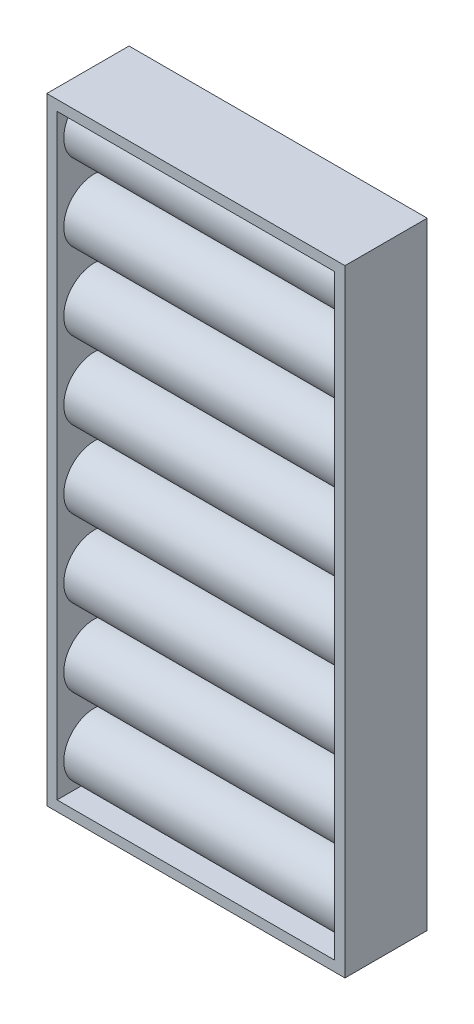
ISO-10303-21;
HEADER;
FILE_DESCRIPTION(('STEP AP214'),'2;1');
FILE_NAME('part.step','',(''),(''),'','','');
FILE_SCHEMA(('AUTOMOTIVE_DESIGN { 1 0 10303 214 1 1 1 1 }'));
ENDSEC;
DATA;
#1=APPLICATION_CONTEXT('core data for automotive mechanical design processes');
#2=APPLICATION_PROTOCOL_DEFINITION('international standard','automotive_design',2000,#1);
#3=PRODUCT_CONTEXT('',#1,'mechanical');
#4=PRODUCT('Part','Part','',(#3));
#5=PRODUCT_RELATED_PRODUCT_CATEGORY('part','',(#4));
#6=PRODUCT_DEFINITION_FORMATION('','',#4);
#7=PRODUCT_DEFINITION_CONTEXT('part definition',#1,'design');
#8=PRODUCT_DEFINITION('design','',#6,#7);
#9=PRODUCT_DEFINITION_SHAPE('','',#8);
#10=(LENGTH_UNIT() NAMED_UNIT(*) SI_UNIT(.MILLI.,.METRE.));
#11=(NAMED_UNIT(*) PLANE_ANGLE_UNIT() SI_UNIT($,.RADIAN.));
#12=(NAMED_UNIT(*) SI_UNIT($,.STERADIAN.) SOLID_ANGLE_UNIT());
#13=UNCERTAINTY_MEASURE_WITH_UNIT(LENGTH_MEASURE(1.E-05),#10,'distance_accuracy_value','');
#14=(GEOMETRIC_REPRESENTATION_CONTEXT(3) GLOBAL_UNCERTAINTY_ASSIGNED_CONTEXT((#13)) GLOBAL_UNIT_ASSIGNED_CONTEXT((#10,
#11,#12)) REPRESENTATION_CONTEXT('',''));
#15=CARTESIAN_POINT('',(0.,0.,0.));
#16=DIRECTION('',(0.,0.,1.));
#17=DIRECTION('',(1.,0.,0.));
#18=AXIS2_PLACEMENT_3D('',#15,#16,#17);
#19=CARTESIAN_POINT('',(-27.,52.8497033839413,8.69302719755597));
#20=DIRECTION('',(1.,0.,0.));
#21=DIRECTION('',(0.,1.,0.));
#22=AXIS2_PLACEMENT_3D('',#19,#20,#21);
#23=PLANE('',#22);
#24=CARTESIAN_POINT('',(-27.,52.8497033839413,8.69302719755597));
#25=DIRECTION('',(1.,0.,0.));
#26=DIRECTION('',(0.,1.,0.));
#27=AXIS2_PLACEMENT_3D('',#24,#25,#26);
#28=CIRCLE('',#27,6.);
#29=CARTESIAN_POINT('',(-27.,58.8497033839413,8.69302719755597));
#30=VERTEX_POINT('',#29);
#31=EDGE_CURVE('E51',#30,#30,#28,.T.);
#32=ORIENTED_EDGE('',*,*,#31,.F.);
#33=EDGE_LOOP('',(#32));
#34=FACE_BOUND('',#33,.T.);
#35=ADVANCED_FACE('F44',(#34),#23,.F.);
#36=CARTESIAN_POINT('',(43.9705627484771,52.8497033839413,8.69302719755597));
#37=DIRECTION('',(-1.,0.,0.));
#38=DIRECTION('',(0.,-1.,0.));
#39=AXIS2_PLACEMENT_3D('',#36,#37,#38);
#40=CYLINDRICAL_SURFACE('',#39,6.);
#41=CARTESIAN_POINT('',(27.,52.8497033839413,8.69302719755597));
#42=DIRECTION('',(-1.,0.,0.));
#43=DIRECTION('',(0.,-1.,0.));
#44=AXIS2_PLACEMENT_3D('',#41,#42,#43);
#45=CIRCLE('',#44,6.);
#46=CARTESIAN_POINT('',(27.,46.8497033839413,8.69302719755597));
#47=VERTEX_POINT('',#46);
#48=EDGE_CURVE('E11',#47,#47,#45,.T.);
#49=ORIENTED_EDGE('',*,*,#48,.T.);
#50=EDGE_LOOP('',(#49));
#51=FACE_BOUND('',#50,.T.);
#52=ORIENTED_EDGE('',*,*,#31,.T.);
#53=EDGE_LOOP('',(#52));
#54=FACE_BOUND('',#53,.T.);
#55=ADVANCED_FACE('F46',(#51,#54),#40,.T.);
#56=CARTESIAN_POINT('',(27.,60.,16.));
#57=DIRECTION('',(-1.,0.,0.));
#58=DIRECTION('',(0.,-1.,0.));
#59=AXIS2_PLACEMENT_3D('',#56,#57,#58);
#60=PLANE('',#59);
#61=ORIENTED_EDGE('',*,*,#48,.F.);
#62=EDGE_LOOP('',(#61));
#63=FACE_BOUND('',#62,.T.);
#64=ADVANCED_FACE('F62',(#63),#60,.F.);
#65=CLOSED_SHELL('',(#35,#55,#64));
#66=MANIFOLD_SOLID_BREP('B2',#65);
#67=CARTESIAN_POINT('',(-27.,37.8497033839413,8.69302719755592));
#68=DIRECTION('',(1.,0.,0.));
#69=DIRECTION('',(0.,1.,0.));
#70=AXIS2_PLACEMENT_3D('',#67,#68,#69);
#71=PLANE('',#70);
#72=CARTESIAN_POINT('',(-27.,37.8497033839413,8.69302719755592));
#73=DIRECTION('',(1.,0.,0.));
#74=DIRECTION('',(0.,1.,0.));
#75=AXIS2_PLACEMENT_3D('',#72,#73,#74);
#76=CIRCLE('',#75,6.);
#77=CARTESIAN_POINT('',(-27.,43.8497033839413,8.69302719755592));
#78=VERTEX_POINT('',#77);
#79=EDGE_CURVE('E100',#78,#78,#76,.T.);
#80=ORIENTED_EDGE('',*,*,#79,.F.);
#81=EDGE_LOOP('',(#80));
#82=FACE_BOUND('',#81,.T.);
#83=ADVANCED_FACE('F93',(#82),#71,.F.);
#84=CARTESIAN_POINT('',(43.9705627484771,37.8497033839413,8.69302719755592));
#85=DIRECTION('',(-1.,0.,0.));
#86=DIRECTION('',(0.,-1.,0.));
#87=AXIS2_PLACEMENT_3D('',#84,#85,#86);
#88=CYLINDRICAL_SURFACE('',#87,6.);
#89=CARTESIAN_POINT('',(27.,37.8497033839413,8.69302719755592));
#90=DIRECTION('',(-1.,0.,0.));
#91=DIRECTION('',(0.,-1.,0.));
#92=AXIS2_PLACEMENT_3D('',#89,#90,#91);
#93=CIRCLE('',#92,6.);
#94=CARTESIAN_POINT('',(27.,31.8497033839413,8.69302719755592));
#95=VERTEX_POINT('',#94);
#96=EDGE_CURVE('E43',#95,#95,#93,.T.);
#97=ORIENTED_EDGE('',*,*,#96,.T.);
#98=EDGE_LOOP('',(#97));
#99=FACE_BOUND('',#98,.T.);
#100=ORIENTED_EDGE('',*,*,#79,.T.);
#101=EDGE_LOOP('',(#100));
#102=FACE_BOUND('',#101,.T.);
#103=ADVANCED_FACE('F95',(#99,#102),#88,.T.);
#104=CARTESIAN_POINT('',(27.,60.,16.));
#105=DIRECTION('',(-1.,0.,0.));
#106=DIRECTION('',(0.,-1.,0.));
#107=AXIS2_PLACEMENT_3D('',#104,#105,#106);
#108=PLANE('',#107);
#109=ORIENTED_EDGE('',*,*,#96,.F.);
#110=EDGE_LOOP('',(#109));
#111=FACE_BOUND('',#110,.T.);
#112=ADVANCED_FACE('F111',(#111),#108,.F.);
#113=CLOSED_SHELL('',(#83,#103,#112));
#114=MANIFOLD_SOLID_BREP('B6',#113);
#115=CARTESIAN_POINT('',(-27.,22.8497033839413,8.69302719755586));
#116=DIRECTION('',(1.,0.,0.));
#117=DIRECTION('',(0.,1.,0.));
#118=AXIS2_PLACEMENT_3D('',#115,#116,#117);
#119=PLANE('',#118);
#120=CARTESIAN_POINT('',(-27.,22.8497033839413,8.69302719755586));
#121=DIRECTION('',(1.,0.,0.));
#122=DIRECTION('',(0.,1.,0.));
#123=AXIS2_PLACEMENT_3D('',#120,#121,#122);
#124=CIRCLE('',#123,6.);
#125=CARTESIAN_POINT('',(-27.,28.8497033839413,8.69302719755586));
#126=VERTEX_POINT('',#125);
#127=EDGE_CURVE('E149',#126,#126,#124,.T.);
#128=ORIENTED_EDGE('',*,*,#127,.F.);
#129=EDGE_LOOP('',(#128));
#130=FACE_BOUND('',#129,.T.);
#131=ADVANCED_FACE('F142',(#130),#119,.F.);
#132=CARTESIAN_POINT('',(43.9705627484771,22.8497033839413,8.69302719755586));
#133=DIRECTION('',(-1.,0.,0.));
#134=DIRECTION('',(0.,-1.,0.));
#135=AXIS2_PLACEMENT_3D('',#132,#133,#134);
#136=CYLINDRICAL_SURFACE('',#135,6.);
#137=CARTESIAN_POINT('',(27.,22.8497033839413,8.69302719755586));
#138=DIRECTION('',(-1.,0.,0.));
#139=DIRECTION('',(0.,-1.,0.));
#140=AXIS2_PLACEMENT_3D('',#137,#138,#139);
#141=CIRCLE('',#140,6.);
#142=CARTESIAN_POINT('',(27.,16.8497033839413,8.69302719755586));
#143=VERTEX_POINT('',#142);
#144=EDGE_CURVE('E92',#143,#143,#141,.T.);
#145=ORIENTED_EDGE('',*,*,#144,.T.);
#146=EDGE_LOOP('',(#145));
#147=FACE_BOUND('',#146,.T.);
#148=ORIENTED_EDGE('',*,*,#127,.T.);
#149=EDGE_LOOP('',(#148));
#150=FACE_BOUND('',#149,.T.);
#151=ADVANCED_FACE('F144',(#147,#150),#136,.T.);
#152=CARTESIAN_POINT('',(27.,60.,16.));
#153=DIRECTION('',(-1.,0.,0.));
#154=DIRECTION('',(0.,-1.,0.));
#155=AXIS2_PLACEMENT_3D('',#152,#153,#154);
#156=PLANE('',#155);
#157=ORIENTED_EDGE('',*,*,#144,.F.);
#158=EDGE_LOOP('',(#157));
#159=FACE_BOUND('',#158,.T.);
#160=ADVANCED_FACE('F160',(#159),#156,.F.);
#161=CLOSED_SHELL('',(#131,#151,#160));
#162=MANIFOLD_SOLID_BREP('B38',#161);
#163=CARTESIAN_POINT('',(-27.,7.84970338394127,8.69302719755581));
#164=DIRECTION('',(1.,0.,0.));
#165=DIRECTION('',(0.,1.,0.));
#166=AXIS2_PLACEMENT_3D('',#163,#164,#165);
#167=PLANE('',#166);
#168=CARTESIAN_POINT('',(-27.,7.84970338394127,8.69302719755581));
#169=DIRECTION('',(1.,0.,0.));
#170=DIRECTION('',(0.,1.,0.));
#171=AXIS2_PLACEMENT_3D('',#168,#169,#170);
#172=CIRCLE('',#171,6.);
#173=CARTESIAN_POINT('',(-27.,13.8497033839413,8.69302719755581));
#174=VERTEX_POINT('',#173);
#175=EDGE_CURVE('E198',#174,#174,#172,.T.);
#176=ORIENTED_EDGE('',*,*,#175,.F.);
#177=EDGE_LOOP('',(#176));
#178=FACE_BOUND('',#177,.T.);
#179=ADVANCED_FACE('F191',(#178),#167,.F.);
#180=CARTESIAN_POINT('',(43.9705627484771,7.84970338394128,8.69302719755581));
#181=DIRECTION('',(-1.,0.,0.));
#182=DIRECTION('',(0.,-1.,0.));
#183=AXIS2_PLACEMENT_3D('',#180,#181,#182);
#184=CYLINDRICAL_SURFACE('',#183,6.);
#185=CARTESIAN_POINT('',(27.,7.84970338394128,8.69302719755581));
#186=DIRECTION('',(-1.,0.,0.));
#187=DIRECTION('',(0.,-1.,0.));
#188=AXIS2_PLACEMENT_3D('',#185,#186,#187);
#189=CIRCLE('',#188,6.);
#190=CARTESIAN_POINT('',(27.,1.84970338394128,8.69302719755581));
#191=VERTEX_POINT('',#190);
#192=EDGE_CURVE('E141',#191,#191,#189,.T.);
#193=ORIENTED_EDGE('',*,*,#192,.T.);
#194=EDGE_LOOP('',(#193));
#195=FACE_BOUND('',#194,.T.);
#196=ORIENTED_EDGE('',*,*,#175,.T.);
#197=EDGE_LOOP('',(#196));
#198=FACE_BOUND('',#197,.T.);
#199=ADVANCED_FACE('F193',(#195,#198),#184,.T.);
#200=CARTESIAN_POINT('',(27.,60.,16.));
#201=DIRECTION('',(-1.,0.,0.));
#202=DIRECTION('',(0.,-1.,0.));
#203=AXIS2_PLACEMENT_3D('',#200,#201,#202);
#204=PLANE('',#203);
#205=ORIENTED_EDGE('',*,*,#192,.F.);
#206=EDGE_LOOP('',(#205));
#207=FACE_BOUND('',#206,.T.);
#208=ADVANCED_FACE('F209',(#207),#204,.F.);
#209=CLOSED_SHELL('',(#179,#199,#208));
#210=MANIFOLD_SOLID_BREP('B87',#209);
#211=CARTESIAN_POINT('',(-27.,-7.15029661605873,8.69302719755576));
#212=DIRECTION('',(1.,0.,0.));
#213=DIRECTION('',(0.,1.,0.));
#214=AXIS2_PLACEMENT_3D('',#211,#212,#213);
#215=PLANE('',#214);
#216=CARTESIAN_POINT('',(-27.,-7.15029661605873,8.69302719755576));
#217=DIRECTION('',(1.,0.,0.));
#218=DIRECTION('',(0.,1.,0.));
#219=AXIS2_PLACEMENT_3D('',#216,#217,#218);
#220=CIRCLE('',#219,6.);
#221=CARTESIAN_POINT('',(-27.,-1.15029661605873,8.69302719755576));
#222=VERTEX_POINT('',#221);
#223=EDGE_CURVE('E247',#222,#222,#220,.T.);
#224=ORIENTED_EDGE('',*,*,#223,.F.);
#225=EDGE_LOOP('',(#224));
#226=FACE_BOUND('',#225,.T.);
#227=ADVANCED_FACE('F240',(#226),#215,.F.);
#228=CARTESIAN_POINT('',(43.9705627484771,-7.15029661605872,8.69302719755576));
#229=DIRECTION('',(-1.,0.,0.));
#230=DIRECTION('',(0.,-1.,0.));
#231=AXIS2_PLACEMENT_3D('',#228,#229,#230);
#232=CYLINDRICAL_SURFACE('',#231,6.);
#233=CARTESIAN_POINT('',(27.,-7.15029661605872,8.69302719755576));
#234=DIRECTION('',(-1.,0.,0.));
#235=DIRECTION('',(0.,-1.,0.));
#236=AXIS2_PLACEMENT_3D('',#233,#234,#235);
#237=CIRCLE('',#236,6.);
#238=CARTESIAN_POINT('',(27.,-13.1502966160587,8.69302719755576));
#239=VERTEX_POINT('',#238);
#240=EDGE_CURVE('E190',#239,#239,#237,.T.);
#241=ORIENTED_EDGE('',*,*,#240,.T.);
#242=EDGE_LOOP('',(#241));
#243=FACE_BOUND('',#242,.T.);
#244=ORIENTED_EDGE('',*,*,#223,.T.);
#245=EDGE_LOOP('',(#244));
#246=FACE_BOUND('',#245,.T.);
#247=ADVANCED_FACE('F242',(#243,#246),#232,.T.);
#248=CARTESIAN_POINT('',(27.,60.,16.));
#249=DIRECTION('',(-1.,0.,0.));
#250=DIRECTION('',(0.,-1.,0.));
#251=AXIS2_PLACEMENT_3D('',#248,#249,#250);
#252=PLANE('',#251);
#253=ORIENTED_EDGE('',*,*,#240,.F.);
#254=EDGE_LOOP('',(#253));
#255=FACE_BOUND('',#254,.T.);
#256=ADVANCED_FACE('F258',(#255),#252,.F.);
#257=CLOSED_SHELL('',(#227,#247,#256));
#258=MANIFOLD_SOLID_BREP('B136',#257);
#259=CARTESIAN_POINT('',(-27.,-22.1502966160587,8.69302719755571));
#260=DIRECTION('',(1.,0.,0.));
#261=DIRECTION('',(0.,1.,0.));
#262=AXIS2_PLACEMENT_3D('',#259,#260,#261);
#263=PLANE('',#262);
#264=CARTESIAN_POINT('',(-27.,-22.1502966160587,8.69302719755571));
#265=DIRECTION('',(1.,0.,0.));
#266=DIRECTION('',(0.,1.,0.));
#267=AXIS2_PLACEMENT_3D('',#264,#265,#266);
#268=CIRCLE('',#267,6.);
#269=CARTESIAN_POINT('',(-27.,-16.1502966160587,8.69302719755571));
#270=VERTEX_POINT('',#269);
#271=EDGE_CURVE('E296',#270,#270,#268,.T.);
#272=ORIENTED_EDGE('',*,*,#271,.F.);
#273=EDGE_LOOP('',(#272));
#274=FACE_BOUND('',#273,.T.);
#275=ADVANCED_FACE('F289',(#274),#263,.F.);
#276=CARTESIAN_POINT('',(43.9705627484771,-22.1502966160587,8.69302719755571));
#277=DIRECTION('',(-1.,0.,0.));
#278=DIRECTION('',(0.,-1.,0.));
#279=AXIS2_PLACEMENT_3D('',#276,#277,#278);
#280=CYLINDRICAL_SURFACE('',#279,6.);
#281=CARTESIAN_POINT('',(27.,-22.1502966160587,8.69302719755571));
#282=DIRECTION('',(-1.,0.,0.));
#283=DIRECTION('',(0.,-1.,0.));
#284=AXIS2_PLACEMENT_3D('',#281,#282,#283);
#285=CIRCLE('',#284,6.);
#286=CARTESIAN_POINT('',(27.,-28.1502966160587,8.69302719755571));
#287=VERTEX_POINT('',#286);
#288=EDGE_CURVE('E239',#287,#287,#285,.T.);
#289=ORIENTED_EDGE('',*,*,#288,.T.);
#290=EDGE_LOOP('',(#289));
#291=FACE_BOUND('',#290,.T.);
#292=ORIENTED_EDGE('',*,*,#271,.T.);
#293=EDGE_LOOP('',(#292));
#294=FACE_BOUND('',#293,.T.);
#295=ADVANCED_FACE('F291',(#291,#294),#280,.T.);
#296=CARTESIAN_POINT('',(27.,60.,16.));
#297=DIRECTION('',(-1.,0.,0.));
#298=DIRECTION('',(0.,-1.,0.));
#299=AXIS2_PLACEMENT_3D('',#296,#297,#298);
#300=PLANE('',#299);
#301=ORIENTED_EDGE('',*,*,#288,.F.);
#302=EDGE_LOOP('',(#301));
#303=FACE_BOUND('',#302,.T.);
#304=ADVANCED_FACE('F307',(#303),#300,.F.);
#305=CLOSED_SHELL('',(#275,#295,#304));
#306=MANIFOLD_SOLID_BREP('B185',#305);
#307=CARTESIAN_POINT('',(-27.,-37.1502966160587,8.69302719755565));
#308=DIRECTION('',(1.,0.,0.));
#309=DIRECTION('',(0.,1.,0.));
#310=AXIS2_PLACEMENT_3D('',#307,#308,#309);
#311=PLANE('',#310);
#312=CARTESIAN_POINT('',(-27.,-37.1502966160587,8.69302719755565));
#313=DIRECTION('',(1.,0.,0.));
#314=DIRECTION('',(0.,1.,0.));
#315=AXIS2_PLACEMENT_3D('',#312,#313,#314);
#316=CIRCLE('',#315,6.);
#317=CARTESIAN_POINT('',(-27.,-31.1502966160587,8.69302719755565));
#318=VERTEX_POINT('',#317);
#319=EDGE_CURVE('E345',#318,#318,#316,.T.);
#320=ORIENTED_EDGE('',*,*,#319,.F.);
#321=EDGE_LOOP('',(#320));
#322=FACE_BOUND('',#321,.T.);
#323=ADVANCED_FACE('F338',(#322),#311,.F.);
#324=CARTESIAN_POINT('',(43.9705627484771,-37.1502966160587,8.69302719755565));
#325=DIRECTION('',(-1.,0.,0.));
#326=DIRECTION('',(0.,-1.,0.));
#327=AXIS2_PLACEMENT_3D('',#324,#325,#326);
#328=CYLINDRICAL_SURFACE('',#327,6.);
#329=CARTESIAN_POINT('',(27.,-37.1502966160587,8.69302719755565));
#330=DIRECTION('',(-1.,0.,0.));
#331=DIRECTION('',(0.,-1.,0.));
#332=AXIS2_PLACEMENT_3D('',#329,#330,#331);
#333=CIRCLE('',#332,6.);
#334=CARTESIAN_POINT('',(27.,-43.1502966160587,8.69302719755565));
#335=VERTEX_POINT('',#334);
#336=EDGE_CURVE('E288',#335,#335,#333,.T.);
#337=ORIENTED_EDGE('',*,*,#336,.T.);
#338=EDGE_LOOP('',(#337));
#339=FACE_BOUND('',#338,.T.);
#340=ORIENTED_EDGE('',*,*,#319,.T.);
#341=EDGE_LOOP('',(#340));
#342=FACE_BOUND('',#341,.T.);
#343=ADVANCED_FACE('F340',(#339,#342),#328,.T.);
#344=CARTESIAN_POINT('',(27.,60.,16.));
#345=DIRECTION('',(-1.,0.,0.));
#346=DIRECTION('',(0.,-1.,0.));
#347=AXIS2_PLACEMENT_3D('',#344,#345,#346);
#348=PLANE('',#347);
#349=ORIENTED_EDGE('',*,*,#336,.F.);
#350=EDGE_LOOP('',(#349));
#351=FACE_BOUND('',#350,.T.);
#352=ADVANCED_FACE('F356',(#351),#348,.F.);
#353=CLOSED_SHELL('',(#323,#343,#352));
#354=MANIFOLD_SOLID_BREP('B234',#353);
#355=CARTESIAN_POINT('',(-27.,-52.1502966160587,8.6930271975556));
#356=DIRECTION('',(1.,0.,0.));
#357=DIRECTION('',(0.,1.,0.));
#358=AXIS2_PLACEMENT_3D('',#355,#356,#357);
#359=PLANE('',#358);
#360=CARTESIAN_POINT('',(-27.,-52.1502966160587,8.6930271975556));
#361=DIRECTION('',(1.,0.,0.));
#362=DIRECTION('',(0.,1.,0.));
#363=AXIS2_PLACEMENT_3D('',#360,#361,#362);
#364=CIRCLE('',#363,6.);
#365=CARTESIAN_POINT('',(-27.,-46.1502966160587,8.6930271975556));
#366=VERTEX_POINT('',#365);
#367=EDGE_CURVE('E395',#366,#366,#364,.T.);
#368=ORIENTED_EDGE('',*,*,#367,.F.);
#369=EDGE_LOOP('',(#368));
#370=FACE_BOUND('',#369,.T.);
#371=ADVANCED_FACE('F388',(#370),#359,.F.);
#372=CARTESIAN_POINT('',(43.9705627484771,-52.1502966160587,8.6930271975556));
#373=DIRECTION('',(-1.,0.,0.));
#374=DIRECTION('',(0.,-1.,0.));
#375=AXIS2_PLACEMENT_3D('',#372,#373,#374);
#376=CYLINDRICAL_SURFACE('',#375,6.);
#377=CARTESIAN_POINT('',(27.,-52.1502966160587,8.6930271975556));
#378=DIRECTION('',(-1.,0.,0.));
#379=DIRECTION('',(0.,-1.,0.));
#380=AXIS2_PLACEMENT_3D('',#377,#378,#379);
#381=CIRCLE('',#380,6.);
#382=CARTESIAN_POINT('',(27.,-58.1502966160587,8.6930271975556));
#383=VERTEX_POINT('',#382);
#384=EDGE_CURVE('E337',#383,#383,#381,.T.);
#385=ORIENTED_EDGE('',*,*,#384,.T.);
#386=EDGE_LOOP('',(#385));
#387=FACE_BOUND('',#386,.T.);
#388=ORIENTED_EDGE('',*,*,#367,.T.);
#389=EDGE_LOOP('',(#388));
#390=FACE_BOUND('',#389,.T.);
#391=ADVANCED_FACE('F390',(#387,#390),#376,.T.);
#392=CARTESIAN_POINT('',(27.,60.,16.));
#393=DIRECTION('',(-1.,0.,0.));
#394=DIRECTION('',(0.,-1.,0.));
#395=AXIS2_PLACEMENT_3D('',#392,#393,#394);
#396=PLANE('',#395);
#397=ORIENTED_EDGE('',*,*,#384,.F.);
#398=EDGE_LOOP('',(#397));
#399=FACE_BOUND('',#398,.T.);
#400=ADVANCED_FACE('F406',(#399),#396,.F.);
#401=CLOSED_SHELL('',(#371,#391,#400));
#402=MANIFOLD_SOLID_BREP('B283',#401);
#403=CARTESIAN_POINT('',(29.,60.,16.));
#404=DIRECTION('',(-1.,0.,0.));
#405=DIRECTION('',(0.,-1.,0.));
#406=AXIS2_PLACEMENT_3D('',#403,#404,#405);
#407=PLANE('',#406);
#408=DIRECTION('',(0.,1.,0.));
#409=VECTOR('',#408,1.);
#410=CARTESIAN_POINT('',(29.,60.,0.));
#411=LINE('',#410,#409);
#412=CARTESIAN_POINT('',(29.,-60.,0.));
#413=VERTEX_POINT('',#412);
#414=CARTESIAN_POINT('',(29.,60.,0.));
#415=VERTEX_POINT('',#414);
#416=EDGE_CURVE('E543',#413,#415,#411,.T.);
#417=ORIENTED_EDGE('',*,*,#416,.T.);
#418=DIRECTION('',(0.,0.,-1.));
#419=VECTOR('',#418,1.);
#420=CARTESIAN_POINT('',(29.,60.,16.));
#421=LINE('',#420,#419);
#422=CARTESIAN_POINT('',(29.,60.,16.));
#423=VERTEX_POINT('',#422);
#424=EDGE_CURVE('E386',#423,#415,#421,.T.);
#425=ORIENTED_EDGE('',*,*,#424,.F.);
#426=DIRECTION('',(0.,1.,0.));
#427=VECTOR('',#426,1.);
#428=CARTESIAN_POINT('',(29.,60.,16.));
#429=LINE('',#428,#427);
#430=CARTESIAN_POINT('',(29.,-60.,16.));
#431=VERTEX_POINT('',#430);
#432=EDGE_CURVE('E536',#431,#423,#429,.T.);
#433=ORIENTED_EDGE('',*,*,#432,.F.);
#434=DIRECTION('',(0.,0.,-1.));
#435=VECTOR('',#434,1.);
#436=CARTESIAN_POINT('',(29.,-60.,16.));
#437=LINE('',#436,#435);
#438=EDGE_CURVE('E542',#431,#413,#437,.T.);
#439=ORIENTED_EDGE('',*,*,#438,.T.);
#440=EDGE_LOOP('',(#417,#425,#433,#439));
#441=FACE_BOUND('',#440,.T.);
#442=ADVANCED_FACE('F429',(#441),#407,.F.);
#443=CARTESIAN_POINT('',(-29.,60.,16.));
#444=DIRECTION('',(0.,-1.,0.));
#445=DIRECTION('',(0.,0.,-1.));
#446=AXIS2_PLACEMENT_3D('',#443,#444,#445);
#447=PLANE('',#446);
#448=DIRECTION('',(-1.,0.,0.));
#449=VECTOR('',#448,1.);
#450=CARTESIAN_POINT('',(-29.,60.,0.));
#451=LINE('',#450,#449);
#452=CARTESIAN_POINT('',(-29.,60.,0.));
#453=VERTEX_POINT('',#452);
#454=EDGE_CURVE('E546',#415,#453,#451,.T.);
#455=ORIENTED_EDGE('',*,*,#454,.T.);
#456=DIRECTION('',(0.,0.,-1.));
#457=VECTOR('',#456,1.);
#458=CARTESIAN_POINT('',(-29.,60.,16.));
#459=LINE('',#458,#457);
#460=CARTESIAN_POINT('',(-29.,60.,16.));
#461=VERTEX_POINT('',#460);
#462=EDGE_CURVE('E436',#461,#453,#459,.T.);
#463=ORIENTED_EDGE('',*,*,#462,.F.);
#464=DIRECTION('',(-1.,0.,0.));
#465=VECTOR('',#464,1.);
#466=CARTESIAN_POINT('',(-29.,60.,16.));
#467=LINE('',#466,#465);
#468=EDGE_CURVE('E480',#423,#461,#467,.T.);
#469=ORIENTED_EDGE('',*,*,#468,.F.);
#470=ORIENTED_EDGE('',*,*,#424,.T.);
#471=EDGE_LOOP('',(#455,#463,#469,#470));
#472=FACE_BOUND('',#471,.T.);
#473=ADVANCED_FACE('F575',(#472),#447,.F.);
#474=CARTESIAN_POINT('',(-29.,60.,16.));
#475=DIRECTION('',(1.,0.,0.));
#476=DIRECTION('',(0.,1.,0.));
#477=AXIS2_PLACEMENT_3D('',#474,#475,#476);
#478=PLANE('',#477);
#479=DIRECTION('',(0.,-1.,0.));
#480=VECTOR('',#479,1.);
#481=CARTESIAN_POINT('',(-29.,60.,0.));
#482=LINE('',#481,#480);
#483=CARTESIAN_POINT('',(-29.,-60.,0.));
#484=VERTEX_POINT('',#483);
#485=EDGE_CURVE('E548',#453,#484,#482,.T.);
#486=ORIENTED_EDGE('',*,*,#485,.T.);
#487=DIRECTION('',(0.,0.,-1.));
#488=VECTOR('',#487,1.);
#489=CARTESIAN_POINT('',(-29.,-60.,16.));
#490=LINE('',#489,#488);
#491=CARTESIAN_POINT('',(-29.,-60.,16.));
#492=VERTEX_POINT('',#491);
#493=EDGE_CURVE('E552',#492,#484,#490,.T.);
#494=ORIENTED_EDGE('',*,*,#493,.F.);
#495=DIRECTION('',(0.,-1.,0.));
#496=VECTOR('',#495,1.);
#497=CARTESIAN_POINT('',(-29.,60.,16.));
#498=LINE('',#497,#496);
#499=EDGE_CURVE('E539',#461,#492,#498,.T.);
#500=ORIENTED_EDGE('',*,*,#499,.F.);
#501=ORIENTED_EDGE('',*,*,#462,.T.);
#502=EDGE_LOOP('',(#486,#494,#500,#501));
#503=FACE_BOUND('',#502,.T.);
#504=ADVANCED_FACE('F557',(#503),#478,.F.);
#505=CARTESIAN_POINT('',(-29.,-60.,16.));
#506=DIRECTION('',(0.,1.,0.));
#507=DIRECTION('',(0.,0.,1.));
#508=AXIS2_PLACEMENT_3D('',#505,#506,#507);
#509=PLANE('',#508);
#510=DIRECTION('',(1.,0.,0.));
#511=VECTOR('',#510,1.);
#512=CARTESIAN_POINT('',(-29.,-60.,0.));
#513=LINE('',#512,#511);
#514=EDGE_CURVE('E473',#484,#413,#513,.T.);
#515=ORIENTED_EDGE('',*,*,#514,.T.);
#516=ORIENTED_EDGE('',*,*,#438,.F.);
#517=DIRECTION('',(1.,0.,0.));
#518=VECTOR('',#517,1.);
#519=CARTESIAN_POINT('',(-29.,-60.,16.));
#520=LINE('',#519,#518);
#521=EDGE_CURVE('E452',#492,#431,#520,.T.);
#522=ORIENTED_EDGE('',*,*,#521,.F.);
#523=ORIENTED_EDGE('',*,*,#493,.T.);
#524=EDGE_LOOP('',(#515,#516,#522,#523));
#525=FACE_BOUND('',#524,.T.);
#526=ADVANCED_FACE('F565',(#525),#509,.F.);
#527=CARTESIAN_POINT('',(0.,0.,16.));
#528=DIRECTION('',(0.,0.,1.));
#529=DIRECTION('',(1.,0.,0.));
#530=AXIS2_PLACEMENT_3D('',#527,#528,#529);
#531=PLANE('',#530);
#532=DIRECTION('',(0.,1.,0.));
#533=VECTOR('',#532,1.);
#534=CARTESIAN_POINT('',(27.,60.,16.));
#535=LINE('',#534,#533);
#536=CARTESIAN_POINT('',(27.,-58.,16.));
#537=VERTEX_POINT('',#536);
#538=CARTESIAN_POINT('',(27.,58.,16.));
#539=VERTEX_POINT('',#538);
#540=EDGE_CURVE('E525',#537,#539,#535,.T.);
#541=ORIENTED_EDGE('',*,*,#540,.F.);
#542=DIRECTION('',(1.,0.,0.));
#543=VECTOR('',#542,1.);
#544=CARTESIAN_POINT('',(-29.,-58.,16.));
#545=LINE('',#544,#543);
#546=CARTESIAN_POINT('',(-27.,-58.,16.));
#547=VERTEX_POINT('',#546);
#548=EDGE_CURVE('E534',#547,#537,#545,.T.);
#549=ORIENTED_EDGE('',*,*,#548,.F.);
#550=DIRECTION('',(0.,-1.,0.));
#551=VECTOR('',#550,1.);
#552=CARTESIAN_POINT('',(-27.,60.,16.));
#553=LINE('',#552,#551);
#554=CARTESIAN_POINT('',(-27.,58.,16.));
#555=VERTEX_POINT('',#554);
#556=EDGE_CURVE('E532',#555,#547,#553,.T.);
#557=ORIENTED_EDGE('',*,*,#556,.F.);
#558=DIRECTION('',(-1.,0.,0.));
#559=VECTOR('',#558,1.);
#560=CARTESIAN_POINT('',(-29.,58.,16.));
#561=LINE('',#560,#559);
#562=EDGE_CURVE('E517',#539,#555,#561,.T.);
#563=ORIENTED_EDGE('',*,*,#562,.F.);
#564=EDGE_LOOP('',(#541,#549,#557,#563));
#565=FACE_BOUND('',#564,.T.);
#566=ORIENTED_EDGE('',*,*,#432,.T.);
#567=ORIENTED_EDGE('',*,*,#468,.T.);
#568=ORIENTED_EDGE('',*,*,#499,.T.);
#569=ORIENTED_EDGE('',*,*,#521,.T.);
#570=EDGE_LOOP('',(#566,#567,#568,#569));
#571=FACE_BOUND('',#570,.T.);
#572=ADVANCED_FACE('F567',(#565,#571),#531,.T.);
#573=CARTESIAN_POINT('',(0.,0.,0.));
#574=DIRECTION('',(0.,0.,1.));
#575=DIRECTION('',(1.,0.,0.));
#576=AXIS2_PLACEMENT_3D('',#573,#574,#575);
#577=PLANE('',#576);
#578=ORIENTED_EDGE('',*,*,#416,.F.);
#579=ORIENTED_EDGE('',*,*,#514,.F.);
#580=ORIENTED_EDGE('',*,*,#485,.F.);
#581=ORIENTED_EDGE('',*,*,#454,.F.);
#582=EDGE_LOOP('',(#578,#579,#580,#581));
#583=FACE_BOUND('',#582,.T.);
#584=ADVANCED_FACE('F561',(#583),#577,.F.);
#585=CARTESIAN_POINT('',(27.,60.,16.));
#586=DIRECTION('',(-1.,0.,0.));
#587=DIRECTION('',(0.,-1.,0.));
#588=AXIS2_PLACEMENT_3D('',#585,#586,#587);
#589=PLANE('',#588);
#590=DIRECTION('',(0.,1.,0.));
#591=VECTOR('',#590,1.);
#592=CARTESIAN_POINT('',(27.,60.,2.));
#593=LINE('',#592,#591);
#594=CARTESIAN_POINT('',(27.,-58.,2.));
#595=VERTEX_POINT('',#594);
#596=CARTESIAN_POINT('',(27.,58.,2.));
#597=VERTEX_POINT('',#596);
#598=EDGE_CURVE('E508',#595,#597,#593,.T.);
#599=ORIENTED_EDGE('',*,*,#598,.F.);
#600=DIRECTION('',(0.,0.,-1.));
#601=VECTOR('',#600,1.);
#602=CARTESIAN_POINT('',(27.,-58.,16.));
#603=LINE('',#602,#601);
#604=EDGE_CURVE('E528',#537,#595,#603,.T.);
#605=ORIENTED_EDGE('',*,*,#604,.F.);
#606=ORIENTED_EDGE('',*,*,#540,.T.);
#607=DIRECTION('',(0.,0.,-1.));
#608=VECTOR('',#607,1.);
#609=CARTESIAN_POINT('',(27.,58.,16.));
#610=LINE('',#609,#608);
#611=EDGE_CURVE('E520',#539,#597,#610,.T.);
#612=ORIENTED_EDGE('',*,*,#611,.T.);
#613=EDGE_LOOP('',(#599,#605,#606,#612));
#614=FACE_BOUND('',#613,.T.);
#615=ADVANCED_FACE('F602',(#614),#589,.T.);
#616=CARTESIAN_POINT('',(-29.,58.,16.));
#617=DIRECTION('',(0.,-1.,0.));
#618=DIRECTION('',(0.,0.,-1.));
#619=AXIS2_PLACEMENT_3D('',#616,#617,#618);
#620=PLANE('',#619);
#621=DIRECTION('',(-1.,0.,0.));
#622=VECTOR('',#621,1.);
#623=CARTESIAN_POINT('',(-29.,58.,2.));
#624=LINE('',#623,#622);
#625=CARTESIAN_POINT('',(-27.,58.,2.));
#626=VERTEX_POINT('',#625);
#627=EDGE_CURVE('E502',#597,#626,#624,.T.);
#628=ORIENTED_EDGE('',*,*,#627,.F.);
#629=ORIENTED_EDGE('',*,*,#611,.F.);
#630=ORIENTED_EDGE('',*,*,#562,.T.);
#631=DIRECTION('',(0.,0.,-1.));
#632=VECTOR('',#631,1.);
#633=CARTESIAN_POINT('',(-27.,58.,16.));
#634=LINE('',#633,#632);
#635=EDGE_CURVE('E514',#555,#626,#634,.T.);
#636=ORIENTED_EDGE('',*,*,#635,.T.);
#637=EDGE_LOOP('',(#628,#629,#630,#636));
#638=FACE_BOUND('',#637,.T.);
#639=ADVANCED_FACE('F515',(#638),#620,.T.);
#640=CARTESIAN_POINT('',(-27.,60.,16.));
#641=DIRECTION('',(1.,0.,0.));
#642=DIRECTION('',(0.,1.,0.));
#643=AXIS2_PLACEMENT_3D('',#640,#641,#642);
#644=PLANE('',#643);
#645=DIRECTION('',(0.,-1.,0.));
#646=VECTOR('',#645,1.);
#647=CARTESIAN_POINT('',(-27.,60.,2.));
#648=LINE('',#647,#646);
#649=CARTESIAN_POINT('',(-27.,-58.,2.));
#650=VERTEX_POINT('',#649);
#651=EDGE_CURVE('E506',#626,#650,#648,.T.);
#652=ORIENTED_EDGE('',*,*,#651,.F.);
#653=ORIENTED_EDGE('',*,*,#635,.F.);
#654=ORIENTED_EDGE('',*,*,#556,.T.);
#655=DIRECTION('',(0.,0.,-1.));
#656=VECTOR('',#655,1.);
#657=CARTESIAN_POINT('',(-27.,-58.,16.));
#658=LINE('',#657,#656);
#659=EDGE_CURVE('E443',#547,#650,#658,.T.);
#660=ORIENTED_EDGE('',*,*,#659,.T.);
#661=EDGE_LOOP('',(#652,#653,#654,#660));
#662=FACE_BOUND('',#661,.T.);
#663=ADVANCED_FACE('F522',(#662),#644,.T.);
#664=CARTESIAN_POINT('',(-29.,-58.,16.));
#665=DIRECTION('',(0.,1.,0.));
#666=DIRECTION('',(0.,0.,1.));
#667=AXIS2_PLACEMENT_3D('',#664,#665,#666);
#668=PLANE('',#667);
#669=DIRECTION('',(1.,0.,0.));
#670=VECTOR('',#669,1.);
#671=CARTESIAN_POINT('',(-29.,-58.,2.));
#672=LINE('',#671,#670);
#673=EDGE_CURVE('E523',#650,#595,#672,.T.);
#674=ORIENTED_EDGE('',*,*,#673,.F.);
#675=ORIENTED_EDGE('',*,*,#659,.F.);
#676=ORIENTED_EDGE('',*,*,#548,.T.);
#677=ORIENTED_EDGE('',*,*,#604,.T.);
#678=EDGE_LOOP('',(#674,#675,#676,#677));
#679=FACE_BOUND('',#678,.T.);
#680=ADVANCED_FACE('F632',(#679),#668,.T.);
#681=CARTESIAN_POINT('',(0.,0.,2.));
#682=DIRECTION('',(0.,0.,1.));
#683=DIRECTION('',(1.,0.,0.));
#684=AXIS2_PLACEMENT_3D('',#681,#682,#683);
#685=PLANE('',#684);
#686=ORIENTED_EDGE('',*,*,#598,.T.);
#687=ORIENTED_EDGE('',*,*,#627,.T.);
#688=ORIENTED_EDGE('',*,*,#651,.T.);
#689=ORIENTED_EDGE('',*,*,#673,.T.);
#690=EDGE_LOOP('',(#686,#687,#688,#689));
#691=FACE_BOUND('',#690,.T.);
#692=ADVANCED_FACE('F504',(#691),#685,.T.);
#693=CLOSED_SHELL('',(#442,#473,#504,#526,#572,#584,#615,#639,#663,#680,#692));
#694=MANIFOLD_SOLID_BREP('B332',#693);
#695=ADVANCED_BREP_SHAPE_REPRESENTATION('',(#18,#66,#114,#162,#210,#258,#306,#354,#402,#694),#14);
#696=SHAPE_DEFINITION_REPRESENTATION(#9,#695);
ENDSEC;
END-ISO-10303-21;
